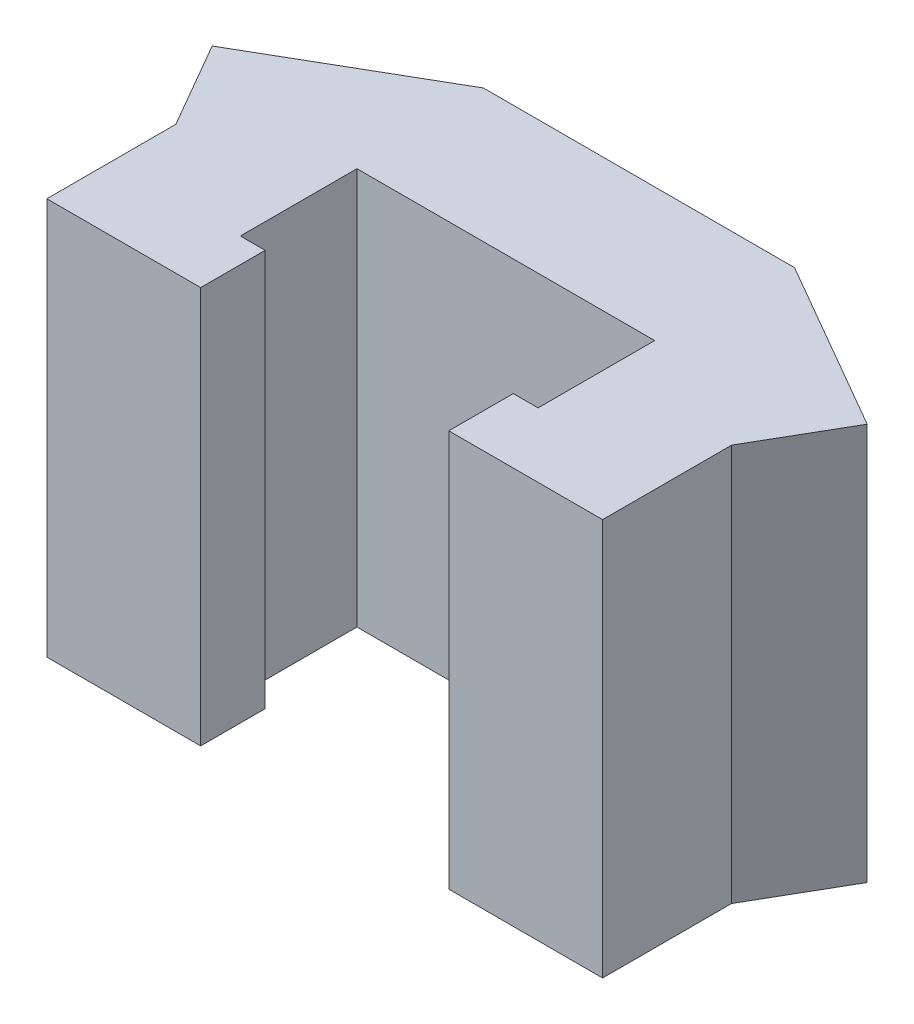
ISO-10303-21;
HEADER;
FILE_DESCRIPTION(('STEP AP214'),'2;1');
FILE_NAME('part.step','',(''),(''),'','','');
FILE_SCHEMA(('AUTOMOTIVE_DESIGN { 1 0 10303 214 1 1 1 1 }'));
ENDSEC;
DATA;
#1=APPLICATION_CONTEXT('core data for automotive mechanical design processes');
#2=APPLICATION_PROTOCOL_DEFINITION('international standard','automotive_design',2000,#1);
#3=PRODUCT_CONTEXT('',#1,'mechanical');
#4=PRODUCT('Part','Part','',(#3));
#5=PRODUCT_RELATED_PRODUCT_CATEGORY('part','',(#4));
#6=PRODUCT_DEFINITION_FORMATION('','',#4);
#7=PRODUCT_DEFINITION_CONTEXT('part definition',#1,'design');
#8=PRODUCT_DEFINITION('design','',#6,#7);
#9=PRODUCT_DEFINITION_SHAPE('','',#8);
#10=(LENGTH_UNIT() NAMED_UNIT(*) SI_UNIT(.MILLI.,.METRE.));
#11=(NAMED_UNIT(*) PLANE_ANGLE_UNIT() SI_UNIT($,.RADIAN.));
#12=(NAMED_UNIT(*) SI_UNIT($,.STERADIAN.) SOLID_ANGLE_UNIT());
#13=UNCERTAINTY_MEASURE_WITH_UNIT(LENGTH_MEASURE(1.E-05),#10,'distance_accuracy_value','');
#14=(GEOMETRIC_REPRESENTATION_CONTEXT(3) GLOBAL_UNCERTAINTY_ASSIGNED_CONTEXT((#13)) GLOBAL_UNIT_ASSIGNED_CONTEXT((#10,
#11,#12)) REPRESENTATION_CONTEXT('',''));
#15=CARTESIAN_POINT('',(0.,0.,0.));
#16=DIRECTION('',(0.,0.,1.));
#17=DIRECTION('',(1.,0.,0.));
#18=AXIS2_PLACEMENT_3D('',#15,#16,#17);
#19=CARTESIAN_POINT('',(-15.0293378561664,40.,-2.52880002436924));
#20=DIRECTION('',(-1.,0.,0.));
#21=DIRECTION('',(0.,0.,1.));
#22=AXIS2_PLACEMENT_3D('',#19,#20,#21);
#23=PLANE('',#22);
#24=DIRECTION('',(0.,0.,-1.));
#25=VECTOR('',#24,1.);
#26=CARTESIAN_POINT('',(-15.0293378561664,0.,-2.52880002436924));
#27=LINE('',#26,#25);
#28=CARTESIAN_POINT('',(-15.0293378561664,0.,9.2211999756307));
#29=VERTEX_POINT('',#28);
#30=CARTESIAN_POINT('',(-15.0293378561664,0.,-2.52880002436924));
#31=VERTEX_POINT('',#30);
#32=EDGE_CURVE('E181',#29,#31,#27,.T.);
#33=ORIENTED_EDGE('',*,*,#32,.T.);
#34=DIRECTION('',(0.,-1.,0.));
#35=VECTOR('',#34,1.);
#36=CARTESIAN_POINT('',(-15.0293378561664,40.,-2.52880002436924));
#37=LINE('',#36,#35);
#38=CARTESIAN_POINT('',(-15.0293378561664,40.,-2.52880002436924));
#39=VERTEX_POINT('',#38);
#40=EDGE_CURVE('E11',#39,#31,#37,.T.);
#41=ORIENTED_EDGE('',*,*,#40,.F.);
#42=DIRECTION('',(0.,0.,-1.));
#43=VECTOR('',#42,1.);
#44=CARTESIAN_POINT('',(-15.0293378561664,40.,-2.52880002436924));
#45=LINE('',#44,#43);
#46=CARTESIAN_POINT('',(-15.0293378561664,40.,9.2211999756307));
#47=VERTEX_POINT('',#46);
#48=EDGE_CURVE('E211',#47,#39,#45,.T.);
#49=ORIENTED_EDGE('',*,*,#48,.F.);
#50=DIRECTION('',(0.,-1.,0.));
#51=VECTOR('',#50,1.);
#52=CARTESIAN_POINT('',(-15.0293378561664,40.,9.2211999756307));
#53=LINE('',#52,#51);
#54=EDGE_CURVE('E177',#47,#29,#53,.T.);
#55=ORIENTED_EDGE('',*,*,#54,.T.);
#56=EDGE_LOOP('',(#33,#41,#49,#55));
#57=FACE_BOUND('',#56,.T.);
#58=ADVANCED_FACE('F37',(#57),#23,.F.);
#59=CARTESIAN_POINT('',(14.9706621438335,40.,-2.52880002436924));
#60=DIRECTION('',(0.,0.,-1.));
#61=DIRECTION('',(-1.,0.,0.));
#62=AXIS2_PLACEMENT_3D('',#59,#60,#61);
#63=PLANE('',#62);
#64=DIRECTION('',(1.,0.,0.));
#65=VECTOR('',#64,1.);
#66=CARTESIAN_POINT('',(14.9706621438335,0.,-2.52880002436924));
#67=LINE('',#66,#65);
#68=CARTESIAN_POINT('',(14.9706621438335,0.,-2.52880002436924));
#69=VERTEX_POINT('',#68);
#70=EDGE_CURVE('E184',#31,#69,#67,.T.);
#71=ORIENTED_EDGE('',*,*,#70,.T.);
#72=DIRECTION('',(0.,-1.,0.));
#73=VECTOR('',#72,1.);
#74=CARTESIAN_POINT('',(14.9706621438335,40.,-2.52880002436924));
#75=LINE('',#74,#73);
#76=CARTESIAN_POINT('',(14.9706621438335,40.,-2.52880002436924));
#77=VERTEX_POINT('',#76);
#78=EDGE_CURVE('E45',#77,#69,#75,.T.);
#79=ORIENTED_EDGE('',*,*,#78,.F.);
#80=DIRECTION('',(1.,0.,0.));
#81=VECTOR('',#80,1.);
#82=CARTESIAN_POINT('',(14.9706621438335,40.,-2.52880002436924));
#83=LINE('',#82,#81);
#84=EDGE_CURVE('E120',#39,#77,#83,.T.);
#85=ORIENTED_EDGE('',*,*,#84,.F.);
#86=ORIENTED_EDGE('',*,*,#40,.T.);
#87=EDGE_LOOP('',(#71,#79,#85,#86));
#88=FACE_BOUND('',#87,.T.);
#89=ADVANCED_FACE('F309',(#88),#63,.F.);
#90=CARTESIAN_POINT('',(14.9706621438335,40.,-2.52880002436924));
#91=DIRECTION('',(1.,0.,0.));
#92=DIRECTION('',(0.,0.,-1.));
#93=AXIS2_PLACEMENT_3D('',#90,#91,#92);
#94=PLANE('',#93);
#95=DIRECTION('',(0.,0.,1.));
#96=VECTOR('',#95,1.);
#97=CARTESIAN_POINT('',(14.9706621438335,0.,-2.52880002436924));
#98=LINE('',#97,#96);
#99=CARTESIAN_POINT('',(14.9706621438335,0.,9.2211999756307));
#100=VERTEX_POINT('',#99);
#101=EDGE_CURVE('E186',#69,#100,#98,.T.);
#102=ORIENTED_EDGE('',*,*,#101,.T.);
#103=DIRECTION('',(0.,-1.,0.));
#104=VECTOR('',#103,1.);
#105=CARTESIAN_POINT('',(14.9706621438335,40.,9.2211999756307));
#106=LINE('',#105,#104);
#107=CARTESIAN_POINT('',(14.9706621438335,40.,9.2211999756307));
#108=VERTEX_POINT('',#107);
#109=EDGE_CURVE('E242',#108,#100,#106,.T.);
#110=ORIENTED_EDGE('',*,*,#109,.F.);
#111=DIRECTION('',(0.,0.,1.));
#112=VECTOR('',#111,1.);
#113=CARTESIAN_POINT('',(14.9706621438335,40.,-2.52880002436924));
#114=LINE('',#113,#112);
#115=EDGE_CURVE('E250',#77,#108,#114,.T.);
#116=ORIENTED_EDGE('',*,*,#115,.F.);
#117=ORIENTED_EDGE('',*,*,#78,.T.);
#118=EDGE_LOOP('',(#102,#110,#116,#117));
#119=FACE_BOUND('',#118,.T.);
#120=ADVANCED_FACE('F248',(#119),#94,.F.);
#121=CARTESIAN_POINT('',(14.9706621438335,40.,9.2211999756307));
#122=DIRECTION('',(0.,0.,1.));
#123=DIRECTION('',(1.,0.,0.));
#124=AXIS2_PLACEMENT_3D('',#121,#122,#123);
#125=PLANE('',#124);
#126=DIRECTION('',(-1.,0.,0.));
#127=VECTOR('',#126,1.);
#128=CARTESIAN_POINT('',(14.9706621438335,0.,9.2211999756307));
#129=LINE('',#128,#127);
#130=CARTESIAN_POINT('',(12.4706621438335,0.,9.22119997563071));
#131=VERTEX_POINT('',#130);
#132=EDGE_CURVE('E188',#100,#131,#129,.T.);
#133=ORIENTED_EDGE('',*,*,#132,.T.);
#134=DIRECTION('',(0.,-1.,0.));
#135=VECTOR('',#134,1.);
#136=CARTESIAN_POINT('',(12.4706621438335,40.,9.22119997563071));
#137=LINE('',#136,#135);
#138=CARTESIAN_POINT('',(12.4706621438335,40.,9.22119997563071));
#139=VERTEX_POINT('',#138);
#140=EDGE_CURVE('E239',#139,#131,#137,.T.);
#141=ORIENTED_EDGE('',*,*,#140,.F.);
#142=DIRECTION('',(-1.,0.,0.));
#143=VECTOR('',#142,1.);
#144=CARTESIAN_POINT('',(14.9706621438335,40.,9.2211999756307));
#145=LINE('',#144,#143);
#146=EDGE_CURVE('E268',#108,#139,#145,.T.);
#147=ORIENTED_EDGE('',*,*,#146,.F.);
#148=ORIENTED_EDGE('',*,*,#109,.T.);
#149=EDGE_LOOP('',(#133,#141,#147,#148));
#150=FACE_BOUND('',#149,.T.);
#151=ADVANCED_FACE('F259',(#150),#125,.F.);
#152=CARTESIAN_POINT('',(12.4706621438335,40.,9.22119997563071));
#153=DIRECTION('',(1.,0.,0.));
#154=DIRECTION('',(0.,0.,-1.));
#155=AXIS2_PLACEMENT_3D('',#152,#153,#154);
#156=PLANE('',#155);
#157=DIRECTION('',(0.,0.,1.));
#158=VECTOR('',#157,1.);
#159=CARTESIAN_POINT('',(12.4706621438335,0.,9.22119997563071));
#160=LINE('',#159,#158);
#161=CARTESIAN_POINT('',(12.4706621438335,0.,15.7211999756308));
#162=VERTEX_POINT('',#161);
#163=EDGE_CURVE('E190',#131,#162,#160,.T.);
#164=ORIENTED_EDGE('',*,*,#163,.T.);
#165=DIRECTION('',(0.,-1.,0.));
#166=VECTOR('',#165,1.);
#167=CARTESIAN_POINT('',(12.4706621438335,40.,15.7211999756308));
#168=LINE('',#167,#166);
#169=CARTESIAN_POINT('',(12.4706621438335,40.,15.7211999756308));
#170=VERTEX_POINT('',#169);
#171=EDGE_CURVE('E236',#170,#162,#168,.T.);
#172=ORIENTED_EDGE('',*,*,#171,.F.);
#173=DIRECTION('',(0.,0.,1.));
#174=VECTOR('',#173,1.);
#175=CARTESIAN_POINT('',(12.4706621438335,40.,9.22119997563071));
#176=LINE('',#175,#174);
#177=EDGE_CURVE('E265',#139,#170,#176,.T.);
#178=ORIENTED_EDGE('',*,*,#177,.F.);
#179=ORIENTED_EDGE('',*,*,#140,.T.);
#180=EDGE_LOOP('',(#164,#172,#178,#179));
#181=FACE_BOUND('',#180,.T.);
#182=ADVANCED_FACE('F263',(#181),#156,.F.);
#183=CARTESIAN_POINT('',(12.4706621438335,40.,15.7211999756308));
#184=DIRECTION('',(0.,0.,-1.));
#185=DIRECTION('',(-1.,0.,0.));
#186=AXIS2_PLACEMENT_3D('',#183,#184,#185);
#187=PLANE('',#186);
#188=DIRECTION('',(1.,0.,0.));
#189=VECTOR('',#188,1.);
#190=CARTESIAN_POINT('',(12.4706621438335,0.,15.7211999756308));
#191=LINE('',#190,#189);
#192=CARTESIAN_POINT('',(27.9706621438335,0.,15.7211999756308));
#193=VERTEX_POINT('',#192);
#194=EDGE_CURVE('E192',#162,#193,#191,.T.);
#195=ORIENTED_EDGE('',*,*,#194,.T.);
#196=DIRECTION('',(0.,-1.,0.));
#197=VECTOR('',#196,1.);
#198=CARTESIAN_POINT('',(27.9706621438335,40.,15.7211999756308));
#199=LINE('',#198,#197);
#200=CARTESIAN_POINT('',(27.9706621438335,40.,15.7211999756308));
#201=VERTEX_POINT('',#200);
#202=EDGE_CURVE('E233',#201,#193,#199,.T.);
#203=ORIENTED_EDGE('',*,*,#202,.F.);
#204=DIRECTION('',(1.,0.,0.));
#205=VECTOR('',#204,1.);
#206=CARTESIAN_POINT('',(12.4706621438335,40.,15.7211999756308));
#207=LINE('',#206,#205);
#208=EDGE_CURVE('E267',#170,#201,#207,.T.);
#209=ORIENTED_EDGE('',*,*,#208,.F.);
#210=ORIENTED_EDGE('',*,*,#171,.T.);
#211=EDGE_LOOP('',(#195,#203,#209,#210));
#212=FACE_BOUND('',#211,.T.);
#213=ADVANCED_FACE('F322',(#212),#187,.F.);
#214=CARTESIAN_POINT('',(27.9706621438335,40.,15.7211999756308));
#215=DIRECTION('',(-1.,0.,0.));
#216=DIRECTION('',(0.,0.,1.));
#217=AXIS2_PLACEMENT_3D('',#214,#215,#216);
#218=PLANE('',#217);
#219=DIRECTION('',(0.,0.,-1.));
#220=VECTOR('',#219,1.);
#221=CARTESIAN_POINT('',(27.9706621438335,0.,15.7211999756308));
#222=LINE('',#221,#220);
#223=CARTESIAN_POINT('',(27.9706621438335,0.,2.72119997563081));
#224=VERTEX_POINT('',#223);
#225=EDGE_CURVE('E194',#193,#224,#222,.T.);
#226=ORIENTED_EDGE('',*,*,#225,.T.);
#227=DIRECTION('',(0.,-1.,0.));
#228=VECTOR('',#227,1.);
#229=CARTESIAN_POINT('',(27.9706621438335,40.,2.72119997563081));
#230=LINE('',#229,#228);
#231=CARTESIAN_POINT('',(27.9706621438335,40.,2.72119997563081));
#232=VERTEX_POINT('',#231);
#233=EDGE_CURVE('E230',#232,#224,#230,.T.);
#234=ORIENTED_EDGE('',*,*,#233,.F.);
#235=DIRECTION('',(0.,0.,-1.));
#236=VECTOR('',#235,1.);
#237=CARTESIAN_POINT('',(27.9706621438335,40.,15.7211999756308));
#238=LINE('',#237,#236);
#239=EDGE_CURVE('E270',#201,#232,#238,.T.);
#240=ORIENTED_EDGE('',*,*,#239,.F.);
#241=ORIENTED_EDGE('',*,*,#202,.T.);
#242=EDGE_LOOP('',(#226,#234,#240,#241));
#243=FACE_BOUND('',#242,.T.);
#244=ADVANCED_FACE('F325',(#243),#218,.F.);
#245=CARTESIAN_POINT('',(27.9706621438335,40.,2.72119997563081));
#246=DIRECTION('',(-0.866025403784438,0.,-0.500000000000001));
#247=DIRECTION('',(-0.500000000000001,0.,0.866025403784438));
#248=AXIS2_PLACEMENT_3D('',#245,#246,#247);
#249=PLANE('',#248);
#250=DIRECTION('',(0.500000000000001,0.,-0.866025403784438));
#251=VECTOR('',#250,1.);
#252=CARTESIAN_POINT('',(27.9706621438335,0.,2.72119997563081));
#253=LINE('',#252,#251);
#254=CARTESIAN_POINT('',(32.9706621438336,0.,-5.93905406221357));
#255=VERTEX_POINT('',#254);
#256=EDGE_CURVE('E196',#224,#255,#253,.T.);
#257=ORIENTED_EDGE('',*,*,#256,.T.);
#258=DIRECTION('',(0.,-1.,0.));
#259=VECTOR('',#258,1.);
#260=CARTESIAN_POINT('',(32.9706621438336,40.,-5.93905406221357));
#261=LINE('',#260,#259);
#262=CARTESIAN_POINT('',(32.9706621438336,40.,-5.93905406221357));
#263=VERTEX_POINT('',#262);
#264=EDGE_CURVE('E227',#263,#255,#261,.T.);
#265=ORIENTED_EDGE('',*,*,#264,.F.);
#266=DIRECTION('',(0.500000000000001,0.,-0.866025403784438));
#267=VECTOR('',#266,1.);
#268=CARTESIAN_POINT('',(27.9706621438335,40.,2.72119997563081));
#269=LINE('',#268,#267);
#270=EDGE_CURVE('E276',#232,#263,#269,.T.);
#271=ORIENTED_EDGE('',*,*,#270,.F.);
#272=ORIENTED_EDGE('',*,*,#233,.T.);
#273=EDGE_LOOP('',(#257,#265,#271,#272));
#274=FACE_BOUND('',#273,.T.);
#275=ADVANCED_FACE('F329',(#274),#249,.F.);
#276=CARTESIAN_POINT('',(32.9706621438336,40.,-5.93905406221357));
#277=DIRECTION('',(-0.500000000000001,0.,0.866025403784438));
#278=DIRECTION('',(0.866025403784438,0.,0.500000000000001));
#279=AXIS2_PLACEMENT_3D('',#276,#277,#278);
#280=PLANE('',#279);
#281=DIRECTION('',(-0.866025403784438,0.,-0.500000000000001));
#282=VECTOR('',#281,1.);
#283=CARTESIAN_POINT('',(32.9706621438336,0.,-5.93905406221357));
#284=LINE('',#283,#282);
#285=CARTESIAN_POINT('',(15.6501540681448,0.,-15.9390540622136));
#286=VERTEX_POINT('',#285);
#287=EDGE_CURVE('E198',#255,#286,#284,.T.);
#288=ORIENTED_EDGE('',*,*,#287,.T.);
#289=DIRECTION('',(0.,-1.,0.));
#290=VECTOR('',#289,1.);
#291=CARTESIAN_POINT('',(15.6501540681448,40.,-15.9390540622136));
#292=LINE('',#291,#290);
#293=CARTESIAN_POINT('',(15.6501540681448,40.,-15.9390540622136));
#294=VERTEX_POINT('',#293);
#295=EDGE_CURVE('E224',#294,#286,#292,.T.);
#296=ORIENTED_EDGE('',*,*,#295,.F.);
#297=DIRECTION('',(-0.866025403784438,0.,-0.500000000000001));
#298=VECTOR('',#297,1.);
#299=CARTESIAN_POINT('',(32.9706621438336,40.,-5.93905406221357));
#300=LINE('',#299,#298);
#301=EDGE_CURVE('E278',#263,#294,#300,.T.);
#302=ORIENTED_EDGE('',*,*,#301,.F.);
#303=ORIENTED_EDGE('',*,*,#264,.T.);
#304=EDGE_LOOP('',(#288,#296,#302,#303));
#305=FACE_BOUND('',#304,.T.);
#306=ADVANCED_FACE('F333',(#305),#280,.F.);
#307=CARTESIAN_POINT('',(-15.7088297804777,40.,-15.9390540622136));
#308=DIRECTION('',(0.,0.,1.));
#309=DIRECTION('',(1.,0.,0.));
#310=AXIS2_PLACEMENT_3D('',#307,#308,#309);
#311=PLANE('',#310);
#312=DIRECTION('',(-1.,0.,0.));
#313=VECTOR('',#312,1.);
#314=CARTESIAN_POINT('',(-15.7088297804777,0.,-15.9390540622136));
#315=LINE('',#314,#313);
#316=CARTESIAN_POINT('',(-15.7088297804777,0.,-15.9390540622136));
#317=VERTEX_POINT('',#316);
#318=EDGE_CURVE('E200',#286,#317,#315,.T.);
#319=ORIENTED_EDGE('',*,*,#318,.T.);
#320=DIRECTION('',(0.,-1.,0.));
#321=VECTOR('',#320,1.);
#322=CARTESIAN_POINT('',(-15.7088297804777,40.,-15.9390540622136));
#323=LINE('',#322,#321);
#324=CARTESIAN_POINT('',(-15.7088297804777,40.,-15.9390540622136));
#325=VERTEX_POINT('',#324);
#326=EDGE_CURVE('E221',#325,#317,#323,.T.);
#327=ORIENTED_EDGE('',*,*,#326,.F.);
#328=DIRECTION('',(-1.,0.,0.));
#329=VECTOR('',#328,1.);
#330=CARTESIAN_POINT('',(-15.7088297804777,40.,-15.9390540622136));
#331=LINE('',#330,#329);
#332=EDGE_CURVE('E280',#294,#325,#331,.T.);
#333=ORIENTED_EDGE('',*,*,#332,.F.);
#334=ORIENTED_EDGE('',*,*,#295,.T.);
#335=EDGE_LOOP('',(#319,#327,#333,#334));
#336=FACE_BOUND('',#335,.T.);
#337=ADVANCED_FACE('F337',(#336),#311,.F.);
#338=CARTESIAN_POINT('',(-33.0293378561664,40.,-5.93905406221357));
#339=DIRECTION('',(0.500000000000001,0.,0.866025403784438));
#340=DIRECTION('',(0.866025403784438,0.,-0.500000000000001));
#341=AXIS2_PLACEMENT_3D('',#338,#339,#340);
#342=PLANE('',#341);
#343=DIRECTION('',(-0.866025403784438,0.,0.500000000000001));
#344=VECTOR('',#343,1.);
#345=CARTESIAN_POINT('',(-33.0293378561664,0.,-5.93905406221357));
#346=LINE('',#345,#344);
#347=CARTESIAN_POINT('',(-33.0293378561664,0.,-5.93905406221357));
#348=VERTEX_POINT('',#347);
#349=EDGE_CURVE('E202',#317,#348,#346,.T.);
#350=ORIENTED_EDGE('',*,*,#349,.T.);
#351=DIRECTION('',(0.,-1.,0.));
#352=VECTOR('',#351,1.);
#353=CARTESIAN_POINT('',(-33.0293378561664,40.,-5.93905406221357));
#354=LINE('',#353,#352);
#355=CARTESIAN_POINT('',(-33.0293378561664,40.,-5.93905406221357));
#356=VERTEX_POINT('',#355);
#357=EDGE_CURVE('E218',#356,#348,#354,.T.);
#358=ORIENTED_EDGE('',*,*,#357,.F.);
#359=DIRECTION('',(-0.866025403784438,0.,0.500000000000001));
#360=VECTOR('',#359,1.);
#361=CARTESIAN_POINT('',(-33.0293378561664,40.,-5.93905406221357));
#362=LINE('',#361,#360);
#363=EDGE_CURVE('E282',#325,#356,#362,.T.);
#364=ORIENTED_EDGE('',*,*,#363,.F.);
#365=ORIENTED_EDGE('',*,*,#326,.T.);
#366=EDGE_LOOP('',(#350,#358,#364,#365));
#367=FACE_BOUND('',#366,.T.);
#368=ADVANCED_FACE('F341',(#367),#342,.F.);
#369=CARTESIAN_POINT('',(-28.0293378561664,40.,2.72119997563081));
#370=DIRECTION('',(0.866025403784438,0.,-0.500000000000001));
#371=DIRECTION('',(-0.500000000000001,0.,-0.866025403784438));
#372=AXIS2_PLACEMENT_3D('',#369,#370,#371);
#373=PLANE('',#372);
#374=DIRECTION('',(0.500000000000001,0.,0.866025403784438));
#375=VECTOR('',#374,1.);
#376=CARTESIAN_POINT('',(-28.0293378561664,0.,2.72119997563081));
#377=LINE('',#376,#375);
#378=CARTESIAN_POINT('',(-28.0293378561664,0.,2.72119997563081));
#379=VERTEX_POINT('',#378);
#380=EDGE_CURVE('E204',#348,#379,#377,.T.);
#381=ORIENTED_EDGE('',*,*,#380,.T.);
#382=DIRECTION('',(0.,-1.,0.));
#383=VECTOR('',#382,1.);
#384=CARTESIAN_POINT('',(-28.0293378561664,40.,2.72119997563081));
#385=LINE('',#384,#383);
#386=CARTESIAN_POINT('',(-28.0293378561664,40.,2.72119997563081));
#387=VERTEX_POINT('',#386);
#388=EDGE_CURVE('E215',#387,#379,#385,.T.);
#389=ORIENTED_EDGE('',*,*,#388,.F.);
#390=DIRECTION('',(0.500000000000001,0.,0.866025403784438));
#391=VECTOR('',#390,1.);
#392=CARTESIAN_POINT('',(-28.0293378561664,40.,2.72119997563081));
#393=LINE('',#392,#391);
#394=EDGE_CURVE('E284',#356,#387,#393,.T.);
#395=ORIENTED_EDGE('',*,*,#394,.F.);
#396=ORIENTED_EDGE('',*,*,#357,.T.);
#397=EDGE_LOOP('',(#381,#389,#395,#396));
#398=FACE_BOUND('',#397,.T.);
#399=ADVANCED_FACE('F290',(#398),#373,.F.);
#400=CARTESIAN_POINT('',(-28.0293378561664,40.,15.7211999756308));
#401=DIRECTION('',(1.,0.,0.));
#402=DIRECTION('',(0.,0.,-1.));
#403=AXIS2_PLACEMENT_3D('',#400,#401,#402);
#404=PLANE('',#403);
#405=DIRECTION('',(0.,0.,1.));
#406=VECTOR('',#405,1.);
#407=CARTESIAN_POINT('',(-28.0293378561664,0.,15.7211999756308));
#408=LINE('',#407,#406);
#409=CARTESIAN_POINT('',(-28.0293378561664,0.,15.7211999756308));
#410=VERTEX_POINT('',#409);
#411=EDGE_CURVE('E206',#379,#410,#408,.T.);
#412=ORIENTED_EDGE('',*,*,#411,.T.);
#413=DIRECTION('',(0.,-1.,0.));
#414=VECTOR('',#413,1.);
#415=CARTESIAN_POINT('',(-28.0293378561664,40.,15.7211999756308));
#416=LINE('',#415,#414);
#417=CARTESIAN_POINT('',(-28.0293378561664,40.,15.7211999756308));
#418=VERTEX_POINT('',#417);
#419=EDGE_CURVE('E172',#418,#410,#416,.T.);
#420=ORIENTED_EDGE('',*,*,#419,.F.);
#421=DIRECTION('',(0.,0.,1.));
#422=VECTOR('',#421,1.);
#423=CARTESIAN_POINT('',(-28.0293378561664,40.,15.7211999756308));
#424=LINE('',#423,#422);
#425=EDGE_CURVE('E163',#387,#418,#424,.T.);
#426=ORIENTED_EDGE('',*,*,#425,.F.);
#427=ORIENTED_EDGE('',*,*,#388,.T.);
#428=EDGE_LOOP('',(#412,#420,#426,#427));
#429=FACE_BOUND('',#428,.T.);
#430=ADVANCED_FACE('F294',(#429),#404,.F.);
#431=CARTESIAN_POINT('',(-12.5293378561664,40.,15.7211999756308));
#432=DIRECTION('',(0.,0.,-1.));
#433=DIRECTION('',(-1.,0.,0.));
#434=AXIS2_PLACEMENT_3D('',#431,#432,#433);
#435=PLANE('',#434);
#436=DIRECTION('',(1.,0.,0.));
#437=VECTOR('',#436,1.);
#438=CARTESIAN_POINT('',(-12.5293378561664,0.,15.7211999756308));
#439=LINE('',#438,#437);
#440=CARTESIAN_POINT('',(-12.5293378561664,0.,15.7211999756308));
#441=VERTEX_POINT('',#440);
#442=EDGE_CURVE('E171',#410,#441,#439,.T.);
#443=ORIENTED_EDGE('',*,*,#442,.T.);
#444=DIRECTION('',(0.,-1.,0.));
#445=VECTOR('',#444,1.);
#446=CARTESIAN_POINT('',(-12.5293378561664,40.,15.7211999756308));
#447=LINE('',#446,#445);
#448=CARTESIAN_POINT('',(-12.5293378561664,40.,15.7211999756308));
#449=VERTEX_POINT('',#448);
#450=EDGE_CURVE('E168',#449,#441,#447,.T.);
#451=ORIENTED_EDGE('',*,*,#450,.F.);
#452=DIRECTION('',(1.,0.,0.));
#453=VECTOR('',#452,1.);
#454=CARTESIAN_POINT('',(-12.5293378561664,40.,15.7211999756308));
#455=LINE('',#454,#453);
#456=EDGE_CURVE('E157',#418,#449,#455,.T.);
#457=ORIENTED_EDGE('',*,*,#456,.F.);
#458=ORIENTED_EDGE('',*,*,#419,.T.);
#459=EDGE_LOOP('',(#443,#451,#457,#458));
#460=FACE_BOUND('',#459,.T.);
#461=ADVANCED_FACE('F169',(#460),#435,.F.);
#462=CARTESIAN_POINT('',(-12.5293378561664,40.,9.22119997563071));
#463=DIRECTION('',(-1.,0.,0.));
#464=DIRECTION('',(0.,0.,1.));
#465=AXIS2_PLACEMENT_3D('',#462,#463,#464);
#466=PLANE('',#465);
#467=DIRECTION('',(0.,0.,-1.));
#468=VECTOR('',#467,1.);
#469=CARTESIAN_POINT('',(-12.5293378561664,0.,9.22119997563071));
#470=LINE('',#469,#468);
#471=CARTESIAN_POINT('',(-12.5293378561664,0.,9.22119997563071));
#472=VERTEX_POINT('',#471);
#473=EDGE_CURVE('E106',#441,#472,#470,.T.);
#474=ORIENTED_EDGE('',*,*,#473,.T.);
#475=DIRECTION('',(0.,-1.,0.));
#476=VECTOR('',#475,1.);
#477=CARTESIAN_POINT('',(-12.5293378561664,40.,9.22119997563071));
#478=LINE('',#477,#476);
#479=CARTESIAN_POINT('',(-12.5293378561664,40.,9.22119997563071));
#480=VERTEX_POINT('',#479);
#481=EDGE_CURVE('E173',#480,#472,#478,.T.);
#482=ORIENTED_EDGE('',*,*,#481,.F.);
#483=DIRECTION('',(0.,0.,-1.));
#484=VECTOR('',#483,1.);
#485=CARTESIAN_POINT('',(-12.5293378561664,40.,9.22119997563071));
#486=LINE('',#485,#484);
#487=EDGE_CURVE('E161',#449,#480,#486,.T.);
#488=ORIENTED_EDGE('',*,*,#487,.F.);
#489=ORIENTED_EDGE('',*,*,#450,.T.);
#490=EDGE_LOOP('',(#474,#482,#488,#489));
#491=FACE_BOUND('',#490,.T.);
#492=ADVANCED_FACE('F175',(#491),#466,.F.);
#493=CARTESIAN_POINT('',(-15.0293378561664,40.,9.2211999756307));
#494=DIRECTION('',(0.,0.,1.));
#495=DIRECTION('',(1.,0.,0.));
#496=AXIS2_PLACEMENT_3D('',#493,#494,#495);
#497=PLANE('',#496);
#498=DIRECTION('',(-1.,0.,0.));
#499=VECTOR('',#498,1.);
#500=CARTESIAN_POINT('',(-15.0293378561664,0.,9.2211999756307));
#501=LINE('',#500,#499);
#502=EDGE_CURVE('E112',#472,#29,#501,.T.);
#503=ORIENTED_EDGE('',*,*,#502,.T.);
#504=ORIENTED_EDGE('',*,*,#54,.F.);
#505=DIRECTION('',(-1.,0.,0.));
#506=VECTOR('',#505,1.);
#507=CARTESIAN_POINT('',(-15.0293378561664,40.,9.2211999756307));
#508=LINE('',#507,#506);
#509=EDGE_CURVE('E53',#480,#47,#508,.T.);
#510=ORIENTED_EDGE('',*,*,#509,.F.);
#511=ORIENTED_EDGE('',*,*,#481,.T.);
#512=EDGE_LOOP('',(#503,#504,#510,#511));
#513=FACE_BOUND('',#512,.T.);
#514=ADVANCED_FACE('F298',(#513),#497,.F.);
#515=CARTESIAN_POINT('',(0.,40.,0.));
#516=DIRECTION('',(0.,1.,0.));
#517=DIRECTION('',(0.,0.,1.));
#518=AXIS2_PLACEMENT_3D('',#515,#516,#517);
#519=PLANE('',#518);
#520=ORIENTED_EDGE('',*,*,#48,.T.);
#521=ORIENTED_EDGE('',*,*,#84,.T.);
#522=ORIENTED_EDGE('',*,*,#115,.T.);
#523=ORIENTED_EDGE('',*,*,#146,.T.);
#524=ORIENTED_EDGE('',*,*,#177,.T.);
#525=ORIENTED_EDGE('',*,*,#208,.T.);
#526=ORIENTED_EDGE('',*,*,#239,.T.);
#527=ORIENTED_EDGE('',*,*,#270,.T.);
#528=ORIENTED_EDGE('',*,*,#301,.T.);
#529=ORIENTED_EDGE('',*,*,#332,.T.);
#530=ORIENTED_EDGE('',*,*,#363,.T.);
#531=ORIENTED_EDGE('',*,*,#394,.T.);
#532=ORIENTED_EDGE('',*,*,#425,.T.);
#533=ORIENTED_EDGE('',*,*,#456,.T.);
#534=ORIENTED_EDGE('',*,*,#487,.T.);
#535=ORIENTED_EDGE('',*,*,#509,.T.);
#536=EDGE_LOOP('',(#520,#521,#522,#523,#524,#525,#526,#527,#528,#529,#530,#531,#532,#533,#534,#535));
#537=FACE_BOUND('',#536,.T.);
#538=ADVANCED_FACE('F159',(#537),#519,.T.);
#539=CARTESIAN_POINT('',(0.,0.,0.));
#540=DIRECTION('',(0.,1.,0.));
#541=DIRECTION('',(0.,0.,1.));
#542=AXIS2_PLACEMENT_3D('',#539,#540,#541);
#543=PLANE('',#542);
#544=ORIENTED_EDGE('',*,*,#32,.F.);
#545=ORIENTED_EDGE('',*,*,#502,.F.);
#546=ORIENTED_EDGE('',*,*,#473,.F.);
#547=ORIENTED_EDGE('',*,*,#442,.F.);
#548=ORIENTED_EDGE('',*,*,#411,.F.);
#549=ORIENTED_EDGE('',*,*,#380,.F.);
#550=ORIENTED_EDGE('',*,*,#349,.F.);
#551=ORIENTED_EDGE('',*,*,#318,.F.);
#552=ORIENTED_EDGE('',*,*,#287,.F.);
#553=ORIENTED_EDGE('',*,*,#256,.F.);
#554=ORIENTED_EDGE('',*,*,#225,.F.);
#555=ORIENTED_EDGE('',*,*,#194,.F.);
#556=ORIENTED_EDGE('',*,*,#163,.F.);
#557=ORIENTED_EDGE('',*,*,#132,.F.);
#558=ORIENTED_EDGE('',*,*,#101,.F.);
#559=ORIENTED_EDGE('',*,*,#70,.F.);
#560=EDGE_LOOP('',(#544,#545,#546,#547,#548,#549,#550,#551,#552,#553,#554,#555,#556,#557,#558,#559));
#561=FACE_BOUND('',#560,.T.);
#562=ADVANCED_FACE('F254',(#561),#543,.F.);
#563=CLOSED_SHELL('',(#58,#89,#120,#151,#182,#213,#244,#275,#306,#337,#368,#399,#430,#461,#492,
#514,#538,#562));
#564=MANIFOLD_SOLID_BREP('B2',#563);
#565=ADVANCED_BREP_SHAPE_REPRESENTATION('',(#18,#564),#14);
#566=SHAPE_DEFINITION_REPRESENTATION(#9,#565);
ENDSEC;
END-ISO-10303-21;
